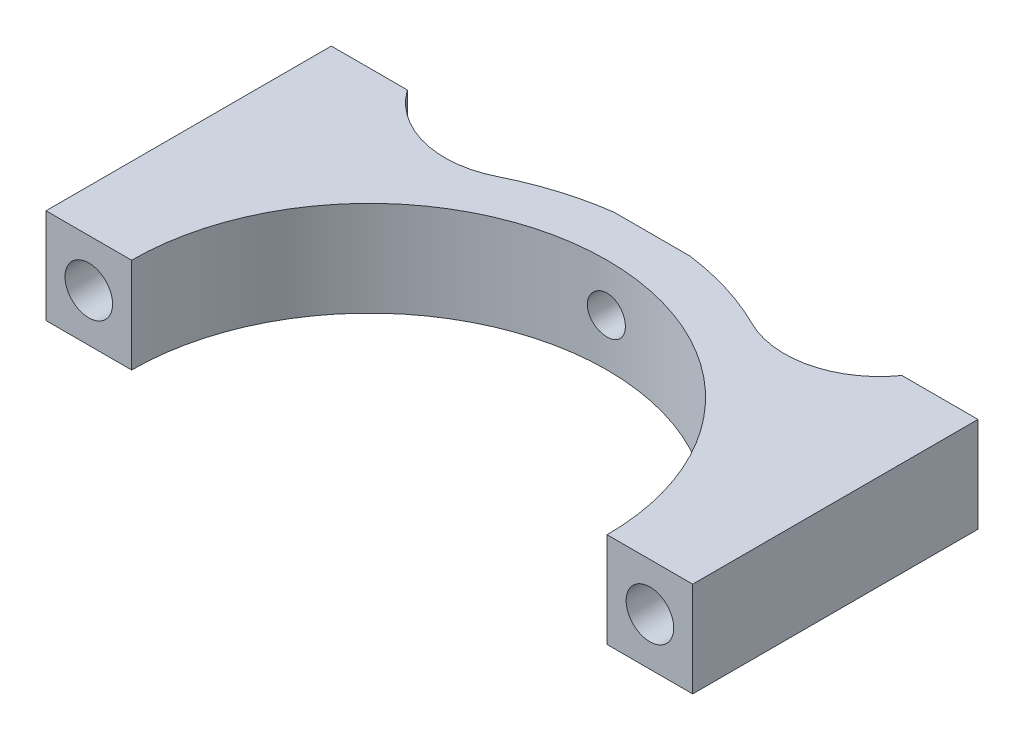
ISO-10303-21;
HEADER;
FILE_DESCRIPTION(('STEP AP214'),'2;1');
FILE_NAME('part.step','',(''),(''),'','','');
FILE_SCHEMA(('AUTOMOTIVE_DESIGN { 1 0 10303 214 1 1 1 1 }'));
ENDSEC;
DATA;
#1=APPLICATION_CONTEXT('core data for automotive mechanical design processes');
#2=APPLICATION_PROTOCOL_DEFINITION('international standard','automotive_design',2000,#1);
#3=PRODUCT_CONTEXT('',#1,'mechanical');
#4=PRODUCT('Part','Part','',(#3));
#5=PRODUCT_RELATED_PRODUCT_CATEGORY('part','',(#4));
#6=PRODUCT_DEFINITION_FORMATION('','',#4);
#7=PRODUCT_DEFINITION_CONTEXT('part definition',#1,'design');
#8=PRODUCT_DEFINITION('design','',#6,#7);
#9=PRODUCT_DEFINITION_SHAPE('','',#8);
#10=(LENGTH_UNIT() NAMED_UNIT(*) SI_UNIT(.MILLI.,.METRE.));
#11=(NAMED_UNIT(*) PLANE_ANGLE_UNIT() SI_UNIT($,.RADIAN.));
#12=(NAMED_UNIT(*) SI_UNIT($,.STERADIAN.) SOLID_ANGLE_UNIT());
#13=UNCERTAINTY_MEASURE_WITH_UNIT(LENGTH_MEASURE(1.E-05),#10,'distance_accuracy_value','');
#14=(GEOMETRIC_REPRESENTATION_CONTEXT(3) GLOBAL_UNCERTAINTY_ASSIGNED_CONTEXT((#13)) GLOBAL_UNIT_ASSIGNED_CONTEXT((#10,
#11,#12)) REPRESENTATION_CONTEXT('',''));
#15=CARTESIAN_POINT('',(0.,0.,0.));
#16=DIRECTION('',(0.,0.,1.));
#17=DIRECTION('',(1.,0.,0.));
#18=AXIS2_PLACEMENT_3D('',#15,#16,#17);
#19=CARTESIAN_POINT('',(1.40512601554121E-13,10.,1.40512601554121E-13));
#20=DIRECTION('',(0.,-1.,0.));
#21=DIRECTION('',(0.,0.,-1.));
#22=AXIS2_PLACEMENT_3D('',#19,#20,#21);
#23=CYLINDRICAL_SURFACE('',#22,25.);
#24=CARTESIAN_POINT('',(-2.,5.,-24.9198715887541));
#25=CARTESIAN_POINT('',(-1.9999950941703,5.11214785367417,-24.9198726522684));
#26=CARTESIAN_POINT('',(-1.99053541620244,5.22437244639174,-24.9206367922876));
#27=CARTESIAN_POINT('',(-1.95293758365848,5.44571765641523,-24.923610827571));
#28=CARTESIAN_POINT('',(-1.92477816145555,5.5548345917809,-24.9258223689548));
#29=CARTESIAN_POINT('',(-1.85059945365149,5.76672655817798,-24.9314391269607));
#30=CARTESIAN_POINT('',(-1.80459016819009,5.86950510290577,-24.934843675114));
#31=CARTESIAN_POINT('',(-1.6960352805711,6.06585570765538,-24.9424620006666));
#32=CARTESIAN_POINT('',(-1.6334932585822,6.15942975490134,-24.946675602811));
#33=CARTESIAN_POINT('',(-1.49348735775318,6.33496241108219,-24.9554485221752));
#34=CARTESIAN_POINT('',(-1.41599233244064,6.41689614416688,-24.9600085487476));
#35=CARTESIAN_POINT('',(-1.24834592768046,6.56660878053209,-24.9689540045206));
#36=CARTESIAN_POINT('',(-1.15819400011786,6.63438707048604,-24.9733394261493));
#37=CARTESIAN_POINT('',(-0.967645557967928,6.75394676703011,-24.9814481937809));
#38=CARTESIAN_POINT('',(-0.867235575540114,6.80570677462311,-24.9851706513305));
#39=CARTESIAN_POINT('',(-0.659115321451846,6.89162374066324,-24.9915264478387));
#40=CARTESIAN_POINT('',(-0.551405168689707,6.9257809857297,-24.9941598045306));
#41=CARTESIAN_POINT('',(-0.33198866101449,6.97545156319553,-24.9980357406249));
#42=CARTESIAN_POINT('',(-0.22029143366981,6.9910049790527,-24.9992813097297));
#43=CARTESIAN_POINT('',(0.00413468563363049,7.00315028336409,-25.000251450691));
#44=CARTESIAN_POINT('',(0.116863559725384,6.99974249958767,-24.9999760488395));
#45=CARTESIAN_POINT('',(0.33988127846099,6.97409496778475,-24.9979377496247));
#46=CARTESIAN_POINT('',(0.450175115760784,6.95189832511151,-24.9961782570913));
#47=CARTESIAN_POINT('',(0.665466600253085,6.88937015827981,-24.9913736289843));
#48=CARTESIAN_POINT('',(0.770464200406883,6.84903847308588,-24.9883284819945));
#49=CARTESIAN_POINT('',(0.972320100838151,6.75133690957109,-24.9812893164183));
#50=CARTESIAN_POINT('',(1.06916899822047,6.69394768512745,-24.9772942214655));
#51=CARTESIAN_POINT('',(1.25187567251951,6.56377416249066,-24.9688042412042));
#52=CARTESIAN_POINT('',(1.33773324420225,6.49098957689705,-24.9643093465661));
#53=CARTESIAN_POINT('',(1.4962720389694,6.3318483837377,-24.9553101851132));
#54=CARTESIAN_POINT('',(1.56891567730062,6.24545432793223,-24.9508059273169));
#55=CARTESIAN_POINT('',(1.69867425388855,6.06167723346418,-24.9423083877228));
#56=CARTESIAN_POINT('',(1.75578918075259,5.96429418673958,-24.9383151062998));
#57=CARTESIAN_POINT('',(1.85286739818872,5.76127751427549,-24.9312908445991));
#58=CARTESIAN_POINT('',(1.89282880411414,5.65564298345684,-24.9282599700701));
#59=CARTESIAN_POINT('',(1.95443813319009,5.43913421449143,-24.9235056669913));
#60=CARTESIAN_POINT('',(1.97608641079295,5.32826007780161,-24.9217822131364));
#61=CARTESIAN_POINT('',(2.00040752371506,5.10474810350466,-24.9198419174339));
#62=CARTESIAN_POINT('',(2.00313274143943,4.99211600037718,-24.919620916564));
#63=CARTESIAN_POINT('',(1.9896675278023,4.76799650527153,-24.9206995682786));
#64=CARTESIAN_POINT('',(1.97347725884277,4.65650910347363,-24.9219992078073));
#65=CARTESIAN_POINT('',(1.92268429552024,4.43799370531438,-24.9259689068765));
#66=CARTESIAN_POINT('',(1.88810598928992,4.33096000426416,-24.9286371510649));
#67=CARTESIAN_POINT('',(1.8015432785373,4.12421370115247,-24.9350418978803));
#68=CARTESIAN_POINT('',(1.74955861628642,4.02450120751968,-24.9387784163247));
#69=CARTESIAN_POINT('',(1.62952606275954,3.83498792071599,-24.9469087763879));
#70=CARTESIAN_POINT('',(1.56144323042104,3.74520932018639,-24.951304040106));
#71=CARTESIAN_POINT('',(1.4111974912002,3.5783364694504,-24.9602518077044));
#72=CARTESIAN_POINT('',(1.32903436084482,3.50124242060278,-24.9648043140796));
#73=CARTESIAN_POINT('',(1.15273413635145,3.36174862332447,-24.9735659546695));
#74=CARTESIAN_POINT('',(1.05857008700419,3.29938288463469,-24.9777742797653));
#75=CARTESIAN_POINT('',(0.861075521021073,3.19134928010455,-24.9853617381436));
#76=CARTESIAN_POINT('',(0.757745089803677,3.14568125868401,-24.9887408791518));
#77=CARTESIAN_POINT('',(0.544973363306904,3.07239797934709,-24.9942854865015));
#78=CARTESIAN_POINT('',(0.435539380382136,3.04476160234249,-24.9964523722392));
#79=CARTESIAN_POINT('',(0.213566444958923,3.00825706662417,-24.9993340665023));
#80=CARTESIAN_POINT('',(0.101027546201402,2.99938858327566,-25.0000489001443));
#81=CARTESIAN_POINT('',(-0.123625182202812,3.00067523677352,-24.9999459942574));
#82=CARTESIAN_POINT('',(-0.235739321412248,3.01077733255689,-24.9991325277981));
#83=CARTESIAN_POINT('',(-0.45667339910102,3.04960788621488,-24.9960728885715));
#84=CARTESIAN_POINT('',(-0.565493332828002,3.07833637095936,-24.9938267137373));
#85=CARTESIAN_POINT('',(-0.776754185264588,3.15359096517567,-24.9881537552202));
#86=CARTESIAN_POINT('',(-0.879195403464534,3.2001162383276,-24.9847270270155));
#87=CARTESIAN_POINT('',(-1.07482124569532,3.30963750462929,-24.9770765727401));
#88=CARTESIAN_POINT('',(-1.1680060327176,3.37263320768928,-24.9728528607068));
#89=CARTESIAN_POINT('',(-1.34274506514851,3.51350600284391,-24.9640686408707));
#90=CARTESIAN_POINT('',(-1.42426769724713,3.59142225377062,-24.9595072666428));
#91=CARTESIAN_POINT('',(-1.57310966426222,3.75985561045411,-24.9505691604846));
#92=CARTESIAN_POINT('',(-1.64042554845709,3.85037576877223,-24.9461924736198));
#93=CARTESIAN_POINT('',(-1.75902672827211,4.04160993448903,-24.9381109120195));
#94=CARTESIAN_POINT('',(-1.81028363477033,4.14234158249305,-24.9344072318267));
#95=CARTESIAN_POINT('',(-1.89509140267038,4.35094149642681,-24.9281057001997));
#96=CARTESIAN_POINT('',(-1.92866268909466,4.4588013672006,-24.9255065737964));
#97=CARTESIAN_POINT('',(-1.96856450610882,4.63941826408231,-24.9223791698146));
#98=CARTESIAN_POINT('',(-1.98033722310361,4.71101253527833,-24.9214431278724));
#99=CARTESIAN_POINT('',(-1.99605654591901,4.85506051962801,-24.9201889943997));
#100=CARTESIAN_POINT('',(-2.00000317083946,4.92751423068375,-24.919870901361));
#101=CARTESIAN_POINT('',(-2.,5.,-24.9198715887541));
#102=B_SPLINE_CURVE_WITH_KNOTS('',3,(#24,#25,#26,#27,#28,#29,#30,#31,#32,#33,#34,#35,#36,#37,
#38,#39,#40,#41,#42,#43,#44,#45,#46,#47,#48,#49,#50,#51,#52,#53,#54,#55,#56,#57,#58,#59,#60,#61,
#62,#63,#64,#65,#66,#67,#68,#69,#70,#71,#72,#73,#74,#75,#76,#77,#78,#79,#80,#81,#82,#83,#84,#85,
#86,#87,#88,#89,#90,#91,#92,#93,#94,#95,#96,#97,#98,#99,#100,#101),.UNSPECIFIED.,.T.,.F.,(4,2,2,
2,2,2,2,2,2,2,2,2,2,2,2,2,2,2,2,2,2,2,2,2,2,2,2,2,2,2,2,2,2,2,2,2,2,2,4),(0.,0.33617890938388,
0.672740818698468,1.0091144454943,1.34541529007445,1.68242434822536,2.0194480052657,
2.35691997146201,2.69438644255223,3.03112449746249,3.36785673142908,3.70381852241059,
4.03978329672297,4.37613057520015,4.71248413315914,5.04977992078598,5.38707595587,
5.72440903998026,6.06173559482743,6.39812799600616,6.73451750905466,7.07046197594158,
7.40641141723673,7.74309684057559,8.07978760805433,8.41724840176261,8.75470605111591,
9.09176774920681,9.42882361697636,9.7649384914207,10.1010538507349,10.4371534170066,
10.7732470640349,11.1102351838792,11.4473050618615,11.7849674942507,12.122239102542,
12.3395258855511,12.5568121382634),.UNSPECIFIED.);
#103=CARTESIAN_POINT('',(-2.,5.,-24.9198715887541));
#104=VERTEX_POINT('',#103);
#105=EDGE_CURVE('E216',#104,#104,#102,.T.);
#106=ORIENTED_EDGE('',*,*,#105,.T.);
#107=EDGE_LOOP('',(#106));
#108=FACE_BOUND('',#107,.T.);
#109=CARTESIAN_POINT('',(1.40512601554121E-13,0.,1.40512601554121E-13));
#110=DIRECTION('',(0.,-1.,0.));
#111=DIRECTION('',(0.,0.,-1.));
#112=AXIS2_PLACEMENT_3D('',#109,#110,#111);
#113=CIRCLE('',#112,25.);
#114=CARTESIAN_POINT('',(-25.,0.,0.));
#115=VERTEX_POINT('',#114);
#116=CARTESIAN_POINT('',(25.,0.,0.));
#117=VERTEX_POINT('',#116);
#118=EDGE_CURVE('E164',#115,#117,#113,.T.);
#119=ORIENTED_EDGE('',*,*,#118,.T.);
#120=DIRECTION('',(0.,-1.,0.));
#121=VECTOR('',#120,1.);
#122=CARTESIAN_POINT('',(25.,10.,0.));
#123=LINE('',#122,#121);
#124=CARTESIAN_POINT('',(25.,10.,0.));
#125=VERTEX_POINT('',#124);
#126=EDGE_CURVE('E11',#125,#117,#123,.T.);
#127=ORIENTED_EDGE('',*,*,#126,.F.);
#128=CARTESIAN_POINT('',(1.40512601554121E-13,10.,1.40512601554121E-13));
#129=DIRECTION('',(0.,-1.,0.));
#130=DIRECTION('',(0.,0.,-1.));
#131=AXIS2_PLACEMENT_3D('',#128,#129,#130);
#132=CIRCLE('',#131,25.);
#133=CARTESIAN_POINT('',(-25.,10.,0.));
#134=VERTEX_POINT('',#133);
#135=EDGE_CURVE('E187',#134,#125,#132,.T.);
#136=ORIENTED_EDGE('',*,*,#135,.F.);
#137=DIRECTION('',(0.,-1.,0.));
#138=VECTOR('',#137,1.);
#139=CARTESIAN_POINT('',(-25.,10.,0.));
#140=LINE('',#139,#138);
#141=EDGE_CURVE('E160',#134,#115,#140,.T.);
#142=ORIENTED_EDGE('',*,*,#141,.T.);
#143=EDGE_LOOP('',(#119,#127,#136,#142));
#144=FACE_BOUND('',#143,.T.);
#145=ADVANCED_FACE('F41',(#108,#144),#23,.F.);
#146=CARTESIAN_POINT('',(25.,10.,0.));
#147=DIRECTION('',(0.,0.,-1.));
#148=DIRECTION('',(-1.,0.,0.));
#149=AXIS2_PLACEMENT_3D('',#146,#147,#148);
#150=PLANE('',#149);
#151=CARTESIAN_POINT('',(29.5,5.,0.));
#152=DIRECTION('',(0.,0.,-1.));
#153=DIRECTION('',(-1.,0.,0.));
#154=AXIS2_PLACEMENT_3D('',#151,#152,#153);
#155=CIRCLE('',#154,2.5);
#156=CARTESIAN_POINT('',(27.,5.,0.));
#157=VERTEX_POINT('',#156);
#158=EDGE_CURVE('E168',#157,#157,#155,.T.);
#159=ORIENTED_EDGE('',*,*,#158,.T.);
#160=EDGE_LOOP('',(#159));
#161=FACE_BOUND('',#160,.T.);
#162=DIRECTION('',(1.,0.,0.));
#163=VECTOR('',#162,1.);
#164=CARTESIAN_POINT('',(25.,0.,0.));
#165=LINE('',#164,#163);
#166=CARTESIAN_POINT('',(34.,0.,0.));
#167=VERTEX_POINT('',#166);
#168=EDGE_CURVE('E167',#117,#167,#165,.T.);
#169=ORIENTED_EDGE('',*,*,#168,.T.);
#170=DIRECTION('',(0.,-1.,0.));
#171=VECTOR('',#170,1.);
#172=CARTESIAN_POINT('',(34.,10.,0.));
#173=LINE('',#172,#171);
#174=CARTESIAN_POINT('',(34.,10.,0.));
#175=VERTEX_POINT('',#174);
#176=EDGE_CURVE('E51',#175,#167,#173,.T.);
#177=ORIENTED_EDGE('',*,*,#176,.F.);
#178=DIRECTION('',(1.,0.,0.));
#179=VECTOR('',#178,1.);
#180=CARTESIAN_POINT('',(25.,10.,0.));
#181=LINE('',#180,#179);
#182=EDGE_CURVE('E115',#125,#175,#181,.T.);
#183=ORIENTED_EDGE('',*,*,#182,.F.);
#184=ORIENTED_EDGE('',*,*,#126,.T.);
#185=EDGE_LOOP('',(#169,#177,#183,#184));
#186=FACE_BOUND('',#185,.T.);
#187=ADVANCED_FACE('F281',(#161,#186),#150,.F.);
#188=CARTESIAN_POINT('',(34.,10.,0.));
#189=DIRECTION('',(-1.,0.,0.));
#190=DIRECTION('',(0.,0.,1.));
#191=AXIS2_PLACEMENT_3D('',#188,#189,#190);
#192=PLANE('',#191);
#193=DIRECTION('',(0.,0.,-1.));
#194=VECTOR('',#193,1.);
#195=CARTESIAN_POINT('',(34.,0.,0.));
#196=LINE('',#195,#194);
#197=CARTESIAN_POINT('',(34.,0.,-30.));
#198=VERTEX_POINT('',#197);
#199=EDGE_CURVE('E170',#167,#198,#196,.T.);
#200=ORIENTED_EDGE('',*,*,#199,.T.);
#201=DIRECTION('',(0.,-1.,0.));
#202=VECTOR('',#201,1.);
#203=CARTESIAN_POINT('',(34.,10.,-30.));
#204=LINE('',#203,#202);
#205=CARTESIAN_POINT('',(34.,10.,-30.));
#206=VERTEX_POINT('',#205);
#207=EDGE_CURVE('E206',#206,#198,#204,.T.);
#208=ORIENTED_EDGE('',*,*,#207,.F.);
#209=DIRECTION('',(0.,0.,-1.));
#210=VECTOR('',#209,1.);
#211=CARTESIAN_POINT('',(34.,10.,0.));
#212=LINE('',#211,#210);
#213=EDGE_CURVE('E296',#175,#206,#212,.T.);
#214=ORIENTED_EDGE('',*,*,#213,.F.);
#215=ORIENTED_EDGE('',*,*,#176,.T.);
#216=EDGE_LOOP('',(#200,#208,#214,#215));
#217=FACE_BOUND('',#216,.T.);
#218=ADVANCED_FACE('F278',(#217),#192,.F.);
#219=CARTESIAN_POINT('',(34.,10.,-30.));
#220=DIRECTION('',(0.,0.,1.));
#221=DIRECTION('',(1.,0.,0.));
#222=AXIS2_PLACEMENT_3D('',#219,#220,#221);
#223=PLANE('',#222);
#224=CARTESIAN_POINT('',(29.5,5.,-30.));
#225=DIRECTION('',(0.,0.,-1.));
#226=DIRECTION('',(-1.,0.,0.));
#227=AXIS2_PLACEMENT_3D('',#224,#225,#226);
#228=CIRCLE('',#227,2.5);
#229=CARTESIAN_POINT('',(27.,5.,-30.));
#230=VERTEX_POINT('',#229);
#231=EDGE_CURVE('E212',#230,#230,#228,.T.);
#232=ORIENTED_EDGE('',*,*,#231,.F.);
#233=EDGE_LOOP('',(#232));
#234=FACE_BOUND('',#233,.T.);
#235=DIRECTION('',(-1.,0.,0.));
#236=VECTOR('',#235,1.);
#237=CARTESIAN_POINT('',(34.,0.,-30.));
#238=LINE('',#237,#236);
#239=CARTESIAN_POINT('',(26.,0.,-30.));
#240=VERTEX_POINT('',#239);
#241=EDGE_CURVE('E172',#198,#240,#238,.T.);
#242=ORIENTED_EDGE('',*,*,#241,.T.);
#243=DIRECTION('',(0.,-1.,0.));
#244=VECTOR('',#243,1.);
#245=CARTESIAN_POINT('',(26.,10.,-30.));
#246=LINE('',#245,#244);
#247=CARTESIAN_POINT('',(26.,10.,-30.));
#248=VERTEX_POINT('',#247);
#249=EDGE_CURVE('E203',#248,#240,#246,.T.);
#250=ORIENTED_EDGE('',*,*,#249,.F.);
#251=DIRECTION('',(-1.,0.,0.));
#252=VECTOR('',#251,1.);
#253=CARTESIAN_POINT('',(34.,10.,-30.));
#254=LINE('',#253,#252);
#255=EDGE_CURVE('E308',#206,#248,#254,.T.);
#256=ORIENTED_EDGE('',*,*,#255,.F.);
#257=ORIENTED_EDGE('',*,*,#207,.T.);
#258=EDGE_LOOP('',(#242,#250,#256,#257));
#259=FACE_BOUND('',#258,.T.);
#260=ADVANCED_FACE('F274',(#234,#259),#223,.F.);
#261=CARTESIAN_POINT('',(17.8509050508978,10.,-35.7958822892219));
#262=DIRECTION('',(0.,-1.,0.));
#263=DIRECTION('',(0.,0.,-1.));
#264=AXIS2_PLACEMENT_3D('',#261,#262,#263);
#265=CYLINDRICAL_SURFACE('',#264,10.);
#266=CARTESIAN_POINT('',(17.8509050508978,0.,-35.7958822892219));
#267=DIRECTION('',(0.,-1.,0.));
#268=DIRECTION('',(0.,0.,-1.));
#269=AXIS2_PLACEMENT_3D('',#266,#267,#268);
#270=CIRCLE('',#269,10.);
#271=CARTESIAN_POINT('',(13.3881787881733,0.,-26.8469117169165));
#272=VERTEX_POINT('',#271);
#273=EDGE_CURVE('E174',#240,#272,#270,.T.);
#274=ORIENTED_EDGE('',*,*,#273,.T.);
#275=DIRECTION('',(0.,-1.,0.));
#276=VECTOR('',#275,1.);
#277=CARTESIAN_POINT('',(13.3881787881733,10.,-26.8469117169165));
#278=LINE('',#277,#276);
#279=CARTESIAN_POINT('',(13.3881787881733,10.,-26.8469117169165));
#280=VERTEX_POINT('',#279);
#281=EDGE_CURVE('E200',#280,#272,#278,.T.);
#282=ORIENTED_EDGE('',*,*,#281,.F.);
#283=CARTESIAN_POINT('',(17.8509050508978,10.,-35.7958822892219));
#284=DIRECTION('',(0.,-1.,0.));
#285=DIRECTION('',(0.,0.,-1.));
#286=AXIS2_PLACEMENT_3D('',#283,#284,#285);
#287=CIRCLE('',#286,10.);
#288=EDGE_CURVE('E305',#248,#280,#287,.T.);
#289=ORIENTED_EDGE('',*,*,#288,.F.);
#290=ORIENTED_EDGE('',*,*,#249,.T.);
#291=EDGE_LOOP('',(#274,#282,#289,#290));
#292=FACE_BOUND('',#291,.T.);
#293=ADVANCED_FACE('F270',(#292),#265,.F.);
#294=CARTESIAN_POINT('',(2.48065457064683E-13,10.,5.20417042793042E-13));
#295=DIRECTION('',(0.,-1.,0.));
#296=DIRECTION('',(0.,0.,-1.));
#297=AXIS2_PLACEMENT_3D('',#294,#295,#296);
#298=CYLINDRICAL_SURFACE('',#297,30.0000000000004);
#299=CARTESIAN_POINT('',(2.48065457064683E-13,0.,5.20417042793042E-13));
#300=DIRECTION('',(0.,1.,0.));
#301=DIRECTION('',(0.,0.,1.));
#302=AXIS2_PLACEMENT_3D('',#299,#300,#301);
#303=CIRCLE('',#302,30.0000000000004);
#304=CARTESIAN_POINT('',(4.,0.,-29.732137494637));
#305=VERTEX_POINT('',#304);
#306=EDGE_CURVE('E176',#272,#305,#303,.T.);
#307=ORIENTED_EDGE('',*,*,#306,.T.);
#308=DIRECTION('',(0.,-1.,0.));
#309=VECTOR('',#308,1.);
#310=CARTESIAN_POINT('',(4.,10.,-29.732137494637));
#311=LINE('',#310,#309);
#312=CARTESIAN_POINT('',(4.,10.,-29.732137494637));
#313=VERTEX_POINT('',#312);
#314=EDGE_CURVE('E197',#313,#305,#311,.T.);
#315=ORIENTED_EDGE('',*,*,#314,.F.);
#316=CARTESIAN_POINT('',(2.48065457064683E-13,10.,5.20417042793042E-13));
#317=DIRECTION('',(0.,1.,0.));
#318=DIRECTION('',(0.,0.,1.));
#319=AXIS2_PLACEMENT_3D('',#316,#317,#318);
#320=CIRCLE('',#319,30.0000000000004);
#321=EDGE_CURVE('E307',#280,#313,#320,.T.);
#322=ORIENTED_EDGE('',*,*,#321,.F.);
#323=ORIENTED_EDGE('',*,*,#281,.T.);
#324=EDGE_LOOP('',(#307,#315,#322,#323));
#325=FACE_BOUND('',#324,.T.);
#326=ADVANCED_FACE('F266',(#325),#298,.T.);
#327=CARTESIAN_POINT('',(-4.,10.,-29.732137494637));
#328=DIRECTION('',(0.,0.,1.));
#329=DIRECTION('',(1.,0.,0.));
#330=AXIS2_PLACEMENT_3D('',#327,#328,#329);
#331=PLANE('',#330);
#332=CARTESIAN_POINT('',(0.,5.,-29.732137494637));
#333=DIRECTION('',(0.,0.,1.));
#334=DIRECTION('',(1.,0.,0.));
#335=AXIS2_PLACEMENT_3D('',#332,#333,#334);
#336=CIRCLE('',#335,2.);
#337=CARTESIAN_POINT('',(2.,5.,-29.732137494637));
#338=VERTEX_POINT('',#337);
#339=EDGE_CURVE('E45',#338,#338,#336,.T.);
#340=ORIENTED_EDGE('',*,*,#339,.T.);
#341=EDGE_LOOP('',(#340));
#342=FACE_BOUND('',#341,.T.);
#343=DIRECTION('',(-1.,0.,0.));
#344=VECTOR('',#343,1.);
#345=CARTESIAN_POINT('',(-4.,0.,-29.732137494637));
#346=LINE('',#345,#344);
#347=CARTESIAN_POINT('',(-4.00000000000001,0.,-29.732137494637));
#348=VERTEX_POINT('',#347);
#349=EDGE_CURVE('E178',#305,#348,#346,.T.);
#350=ORIENTED_EDGE('',*,*,#349,.T.);
#351=DIRECTION('',(0.,-1.,0.));
#352=VECTOR('',#351,1.);
#353=CARTESIAN_POINT('',(-4.00000000000001,10.,-29.732137494637));
#354=LINE('',#353,#352);
#355=CARTESIAN_POINT('',(-4.00000000000001,10.,-29.732137494637));
#356=VERTEX_POINT('',#355);
#357=EDGE_CURVE('E194',#356,#348,#354,.T.);
#358=ORIENTED_EDGE('',*,*,#357,.F.);
#359=DIRECTION('',(-1.,0.,0.));
#360=VECTOR('',#359,1.);
#361=CARTESIAN_POINT('',(-4.,10.,-29.732137494637));
#362=LINE('',#361,#360);
#363=EDGE_CURVE('E310',#313,#356,#362,.T.);
#364=ORIENTED_EDGE('',*,*,#363,.F.);
#365=ORIENTED_EDGE('',*,*,#314,.T.);
#366=EDGE_LOOP('',(#350,#358,#364,#365));
#367=FACE_BOUND('',#366,.T.);
#368=ADVANCED_FACE('F262',(#342,#367),#331,.F.);
#369=CARTESIAN_POINT('',(2.48065457064683E-13,10.,5.20417042793042E-13));
#370=DIRECTION('',(0.,-1.,0.));
#371=DIRECTION('',(0.,0.,-1.));
#372=AXIS2_PLACEMENT_3D('',#369,#370,#371);
#373=CYLINDRICAL_SURFACE('',#372,30.0000000000006);
#374=CARTESIAN_POINT('',(2.48065457064683E-13,0.,5.20417042793042E-13));
#375=DIRECTION('',(0.,1.,0.));
#376=DIRECTION('',(0.,0.,-1.));
#377=AXIS2_PLACEMENT_3D('',#374,#375,#376);
#378=CIRCLE('',#377,30.0000000000006);
#379=CARTESIAN_POINT('',(-13.3881787881733,0.,-26.8469117169165));
#380=VERTEX_POINT('',#379);
#381=EDGE_CURVE('E180',#348,#380,#378,.T.);
#382=ORIENTED_EDGE('',*,*,#381,.T.);
#383=DIRECTION('',(0.,-1.,0.));
#384=VECTOR('',#383,1.);
#385=CARTESIAN_POINT('',(-13.3881787881733,10.,-26.8469117169165));
#386=LINE('',#385,#384);
#387=CARTESIAN_POINT('',(-13.3881787881733,10.,-26.8469117169165));
#388=VERTEX_POINT('',#387);
#389=EDGE_CURVE('E191',#388,#380,#386,.T.);
#390=ORIENTED_EDGE('',*,*,#389,.F.);
#391=CARTESIAN_POINT('',(2.48065457064683E-13,10.,5.20417042793042E-13));
#392=DIRECTION('',(0.,1.,0.));
#393=DIRECTION('',(0.,0.,-1.));
#394=AXIS2_PLACEMENT_3D('',#391,#392,#393);
#395=CIRCLE('',#394,30.0000000000006);
#396=EDGE_CURVE('E316',#356,#388,#395,.T.);
#397=ORIENTED_EDGE('',*,*,#396,.F.);
#398=ORIENTED_EDGE('',*,*,#357,.T.);
#399=EDGE_LOOP('',(#382,#390,#397,#398));
#400=FACE_BOUND('',#399,.T.);
#401=ADVANCED_FACE('F258',(#400),#373,.T.);
#402=CARTESIAN_POINT('',(-17.8509050508978,10.,-35.7958822892219));
#403=DIRECTION('',(0.,-1.,0.));
#404=DIRECTION('',(0.,0.,-1.));
#405=AXIS2_PLACEMENT_3D('',#402,#403,#404);
#406=CYLINDRICAL_SURFACE('',#405,10.);
#407=CARTESIAN_POINT('',(-17.8509050508978,0.,-35.7958822892219));
#408=DIRECTION('',(0.,-1.,0.));
#409=DIRECTION('',(0.,0.,1.));
#410=AXIS2_PLACEMENT_3D('',#407,#408,#409);
#411=CIRCLE('',#410,10.);
#412=CARTESIAN_POINT('',(-26.,0.,-30.));
#413=VERTEX_POINT('',#412);
#414=EDGE_CURVE('E182',#380,#413,#411,.T.);
#415=ORIENTED_EDGE('',*,*,#414,.T.);
#416=DIRECTION('',(0.,-1.,0.));
#417=VECTOR('',#416,1.);
#418=CARTESIAN_POINT('',(-26.,10.,-30.));
#419=LINE('',#418,#417);
#420=CARTESIAN_POINT('',(-26.,10.,-30.));
#421=VERTEX_POINT('',#420);
#422=EDGE_CURVE('E155',#421,#413,#419,.T.);
#423=ORIENTED_EDGE('',*,*,#422,.F.);
#424=CARTESIAN_POINT('',(-17.8509050508978,10.,-35.7958822892219));
#425=DIRECTION('',(0.,-1.,0.));
#426=DIRECTION('',(0.,0.,1.));
#427=AXIS2_PLACEMENT_3D('',#424,#425,#426);
#428=CIRCLE('',#427,10.);
#429=EDGE_CURVE('E146',#388,#421,#428,.T.);
#430=ORIENTED_EDGE('',*,*,#429,.F.);
#431=ORIENTED_EDGE('',*,*,#389,.T.);
#432=EDGE_LOOP('',(#415,#423,#430,#431));
#433=FACE_BOUND('',#432,.T.);
#434=ADVANCED_FACE('F254',(#433),#406,.F.);
#435=CARTESIAN_POINT('',(-34.,10.,-30.));
#436=DIRECTION('',(0.,0.,1.));
#437=DIRECTION('',(1.,0.,0.));
#438=AXIS2_PLACEMENT_3D('',#435,#436,#437);
#439=PLANE('',#438);
#440=CARTESIAN_POINT('',(-29.5,5.,-30.));
#441=DIRECTION('',(0.,0.,-1.));
#442=DIRECTION('',(1.,0.,0.));
#443=AXIS2_PLACEMENT_3D('',#440,#441,#442);
#444=CIRCLE('',#443,2.49999999999999);
#445=CARTESIAN_POINT('',(-27.,5.,-30.));
#446=VERTEX_POINT('',#445);
#447=EDGE_CURVE('E218',#446,#446,#444,.T.);
#448=ORIENTED_EDGE('',*,*,#447,.F.);
#449=EDGE_LOOP('',(#448));
#450=FACE_BOUND('',#449,.T.);
#451=DIRECTION('',(-1.,0.,0.));
#452=VECTOR('',#451,1.);
#453=CARTESIAN_POINT('',(-34.,0.,-30.));
#454=LINE('',#453,#452);
#455=CARTESIAN_POINT('',(-34.,0.,-30.));
#456=VERTEX_POINT('',#455);
#457=EDGE_CURVE('E154',#413,#456,#454,.T.);
#458=ORIENTED_EDGE('',*,*,#457,.T.);
#459=DIRECTION('',(0.,-1.,0.));
#460=VECTOR('',#459,1.);
#461=CARTESIAN_POINT('',(-34.,10.,-30.));
#462=LINE('',#461,#460);
#463=CARTESIAN_POINT('',(-34.,10.,-30.));
#464=VERTEX_POINT('',#463);
#465=EDGE_CURVE('E151',#464,#456,#462,.T.);
#466=ORIENTED_EDGE('',*,*,#465,.F.);
#467=DIRECTION('',(-1.,0.,0.));
#468=VECTOR('',#467,1.);
#469=CARTESIAN_POINT('',(-34.,10.,-30.));
#470=LINE('',#469,#468);
#471=EDGE_CURVE('E140',#421,#464,#470,.T.);
#472=ORIENTED_EDGE('',*,*,#471,.F.);
#473=ORIENTED_EDGE('',*,*,#422,.T.);
#474=EDGE_LOOP('',(#458,#466,#472,#473));
#475=FACE_BOUND('',#474,.T.);
#476=ADVANCED_FACE('F152',(#450,#475),#439,.F.);
#477=CARTESIAN_POINT('',(-34.,10.,0.));
#478=DIRECTION('',(1.,0.,0.));
#479=DIRECTION('',(0.,0.,-1.));
#480=AXIS2_PLACEMENT_3D('',#477,#478,#479);
#481=PLANE('',#480);
#482=DIRECTION('',(0.,0.,1.));
#483=VECTOR('',#482,1.);
#484=CARTESIAN_POINT('',(-34.,0.,0.));
#485=LINE('',#484,#483);
#486=CARTESIAN_POINT('',(-34.,0.,0.));
#487=VERTEX_POINT('',#486);
#488=EDGE_CURVE('E101',#456,#487,#485,.T.);
#489=ORIENTED_EDGE('',*,*,#488,.T.);
#490=DIRECTION('',(0.,-1.,0.));
#491=VECTOR('',#490,1.);
#492=CARTESIAN_POINT('',(-34.,10.,0.));
#493=LINE('',#492,#491);
#494=CARTESIAN_POINT('',(-34.,10.,0.));
#495=VERTEX_POINT('',#494);
#496=EDGE_CURVE('E156',#495,#487,#493,.T.);
#497=ORIENTED_EDGE('',*,*,#496,.F.);
#498=DIRECTION('',(0.,0.,1.));
#499=VECTOR('',#498,1.);
#500=CARTESIAN_POINT('',(-34.,10.,0.));
#501=LINE('',#500,#499);
#502=EDGE_CURVE('E144',#464,#495,#501,.T.);
#503=ORIENTED_EDGE('',*,*,#502,.F.);
#504=ORIENTED_EDGE('',*,*,#465,.T.);
#505=EDGE_LOOP('',(#489,#497,#503,#504));
#506=FACE_BOUND('',#505,.T.);
#507=ADVANCED_FACE('F158',(#506),#481,.F.);
#508=CARTESIAN_POINT('',(-25.,10.,0.));
#509=DIRECTION('',(0.,0.,-1.));
#510=DIRECTION('',(-1.,0.,0.));
#511=AXIS2_PLACEMENT_3D('',#508,#509,#510);
#512=PLANE('',#511);
#513=CARTESIAN_POINT('',(-29.5,5.,0.));
#514=DIRECTION('',(0.,0.,-1.));
#515=DIRECTION('',(-1.,0.,0.));
#516=AXIS2_PLACEMENT_3D('',#513,#514,#515);
#517=CIRCLE('',#516,2.49999999999999);
#518=CARTESIAN_POINT('',(-32.,5.,0.));
#519=VERTEX_POINT('',#518);
#520=EDGE_CURVE('E210',#519,#519,#517,.T.);
#521=ORIENTED_EDGE('',*,*,#520,.T.);
#522=EDGE_LOOP('',(#521));
#523=FACE_BOUND('',#522,.T.);
#524=DIRECTION('',(1.,0.,0.));
#525=VECTOR('',#524,1.);
#526=CARTESIAN_POINT('',(-25.,0.,0.));
#527=LINE('',#526,#525);
#528=EDGE_CURVE('E107',#487,#115,#527,.T.);
#529=ORIENTED_EDGE('',*,*,#528,.T.);
#530=ORIENTED_EDGE('',*,*,#141,.F.);
#531=DIRECTION('',(1.,0.,0.));
#532=VECTOR('',#531,1.);
#533=CARTESIAN_POINT('',(-25.,10.,0.));
#534=LINE('',#533,#532);
#535=EDGE_CURVE('E60',#495,#134,#534,.T.);
#536=ORIENTED_EDGE('',*,*,#535,.F.);
#537=ORIENTED_EDGE('',*,*,#496,.T.);
#538=EDGE_LOOP('',(#529,#530,#536,#537));
#539=FACE_BOUND('',#538,.T.);
#540=ADVANCED_FACE('F244',(#523,#539),#512,.F.);
#541=CARTESIAN_POINT('',(1.40512601554121E-13,10.,1.40512601554121E-13));
#542=DIRECTION('',(0.,-1.,0.));
#543=DIRECTION('',(0.,0.,-1.));
#544=AXIS2_PLACEMENT_3D('',#541,#542,#543);
#545=PLANE('',#544);
#546=ORIENTED_EDGE('',*,*,#135,.T.);
#547=ORIENTED_EDGE('',*,*,#182,.T.);
#548=ORIENTED_EDGE('',*,*,#213,.T.);
#549=ORIENTED_EDGE('',*,*,#255,.T.);
#550=ORIENTED_EDGE('',*,*,#288,.T.);
#551=ORIENTED_EDGE('',*,*,#321,.T.);
#552=ORIENTED_EDGE('',*,*,#363,.T.);
#553=ORIENTED_EDGE('',*,*,#396,.T.);
#554=ORIENTED_EDGE('',*,*,#429,.T.);
#555=ORIENTED_EDGE('',*,*,#471,.T.);
#556=ORIENTED_EDGE('',*,*,#502,.T.);
#557=ORIENTED_EDGE('',*,*,#535,.T.);
#558=EDGE_LOOP('',(#546,#547,#548,#549,#550,#551,#552,#553,#554,#555,#556,#557));
#559=FACE_BOUND('',#558,.T.);
#560=ADVANCED_FACE('F142',(#559),#545,.F.);
#561=CARTESIAN_POINT('',(1.40512601554121E-13,0.,1.40512601554121E-13));
#562=DIRECTION('',(0.,-1.,0.));
#563=DIRECTION('',(0.,0.,-1.));
#564=AXIS2_PLACEMENT_3D('',#561,#562,#563);
#565=PLANE('',#564);
#566=ORIENTED_EDGE('',*,*,#118,.F.);
#567=ORIENTED_EDGE('',*,*,#528,.F.);
#568=ORIENTED_EDGE('',*,*,#488,.F.);
#569=ORIENTED_EDGE('',*,*,#457,.F.);
#570=ORIENTED_EDGE('',*,*,#414,.F.);
#571=ORIENTED_EDGE('',*,*,#381,.F.);
#572=ORIENTED_EDGE('',*,*,#349,.F.);
#573=ORIENTED_EDGE('',*,*,#306,.F.);
#574=ORIENTED_EDGE('',*,*,#273,.F.);
#575=ORIENTED_EDGE('',*,*,#241,.F.);
#576=ORIENTED_EDGE('',*,*,#199,.F.);
#577=ORIENTED_EDGE('',*,*,#168,.F.);
#578=EDGE_LOOP('',(#566,#567,#568,#569,#570,#571,#572,#573,#574,#575,#576,#577));
#579=FACE_BOUND('',#578,.T.);
#580=ADVANCED_FACE('F243',(#579),#565,.T.);
#581=CARTESIAN_POINT('',(-29.5,5.,10.));
#582=DIRECTION('',(0.,0.,-1.));
#583=DIRECTION('',(-1.,0.,0.));
#584=AXIS2_PLACEMENT_3D('',#581,#582,#583);
#585=CYLINDRICAL_SURFACE('',#584,2.49999999999999);
#586=ORIENTED_EDGE('',*,*,#447,.T.);
#587=EDGE_LOOP('',(#586));
#588=FACE_BOUND('',#587,.T.);
#589=ORIENTED_EDGE('',*,*,#520,.F.);
#590=EDGE_LOOP('',(#589));
#591=FACE_BOUND('',#590,.T.);
#592=ADVANCED_FACE('F238',(#588,#591),#585,.F.);
#593=CARTESIAN_POINT('',(0.,5.,10.));
#594=DIRECTION('',(0.,0.,-1.));
#595=DIRECTION('',(-1.,0.,0.));
#596=AXIS2_PLACEMENT_3D('',#593,#594,#595);
#597=CYLINDRICAL_SURFACE('',#596,2.);
#598=ORIENTED_EDGE('',*,*,#339,.F.);
#599=EDGE_LOOP('',(#598));
#600=FACE_BOUND('',#599,.T.);
#601=ORIENTED_EDGE('',*,*,#105,.F.);
#602=EDGE_LOOP('',(#601));
#603=FACE_BOUND('',#602,.T.);
#604=ADVANCED_FACE('F232',(#600,#603),#597,.F.);
#605=CARTESIAN_POINT('',(29.5,5.,10.));
#606=DIRECTION('',(0.,0.,-1.));
#607=DIRECTION('',(-1.,0.,0.));
#608=AXIS2_PLACEMENT_3D('',#605,#606,#607);
#609=CYLINDRICAL_SURFACE('',#608,2.5);
#610=ORIENTED_EDGE('',*,*,#231,.T.);
#611=EDGE_LOOP('',(#610));
#612=FACE_BOUND('',#611,.T.);
#613=ORIENTED_EDGE('',*,*,#158,.F.);
#614=EDGE_LOOP('',(#613));
#615=FACE_BOUND('',#614,.T.);
#616=ADVANCED_FACE('F237',(#612,#615),#609,.F.);
#617=CLOSED_SHELL('',(#145,#187,#218,#260,#293,#326,#368,#401,#434,#476,#507,#540,#560,#580,
#592,#604,#616));
#618=MANIFOLD_SOLID_BREP('B2',#617);
#619=ADVANCED_BREP_SHAPE_REPRESENTATION('',(#18,#618),#14);
#620=SHAPE_DEFINITION_REPRESENTATION(#9,#619);
ENDSEC;
END-ISO-10303-21;
